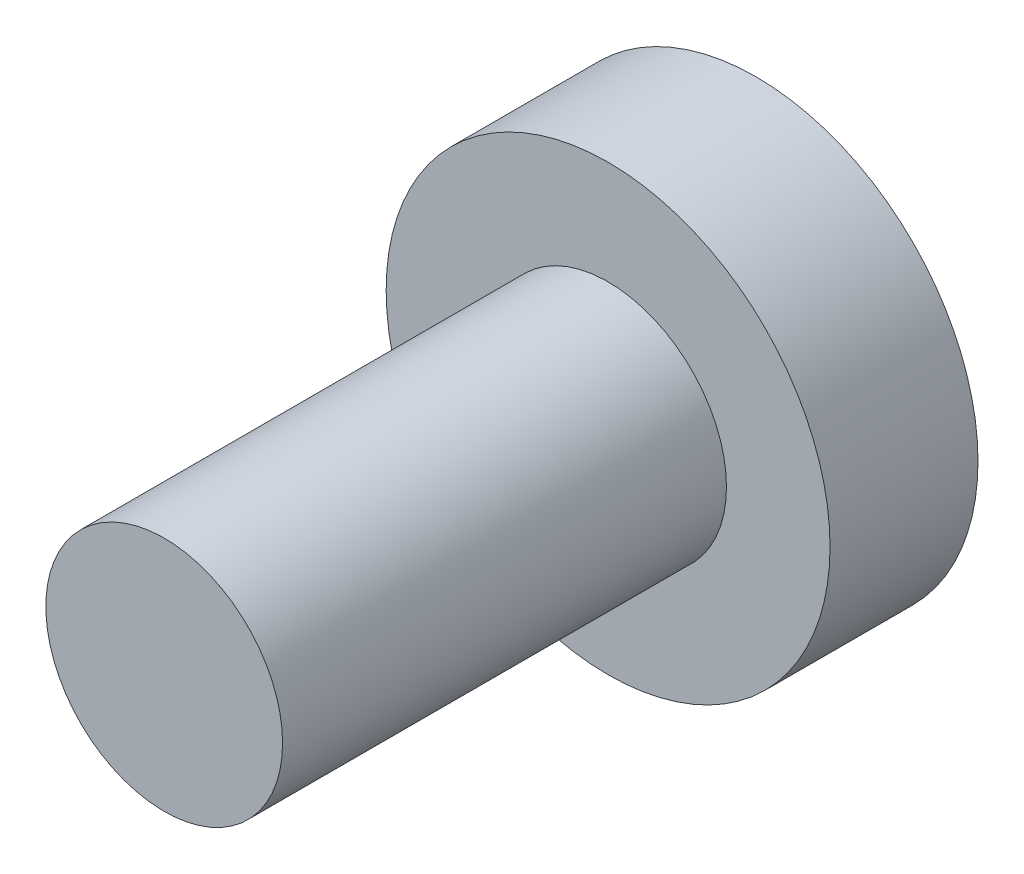
ISO-10303-21;
HEADER;
FILE_DESCRIPTION(('STEP AP214'),'2;1');
FILE_NAME('part.step','',(''),(''),'','','');
FILE_SCHEMA(('AUTOMOTIVE_DESIGN { 1 0 10303 214 1 1 1 1 }'));
ENDSEC;
DATA;
#1=APPLICATION_CONTEXT('core data for automotive mechanical design processes');
#2=APPLICATION_PROTOCOL_DEFINITION('international standard','automotive_design',2000,#1);
#3=PRODUCT_CONTEXT('',#1,'mechanical');
#4=PRODUCT('Part','Part','',(#3));
#5=PRODUCT_RELATED_PRODUCT_CATEGORY('part','',(#4));
#6=PRODUCT_DEFINITION_FORMATION('','',#4);
#7=PRODUCT_DEFINITION_CONTEXT('part definition',#1,'design');
#8=PRODUCT_DEFINITION('design','',#6,#7);
#9=PRODUCT_DEFINITION_SHAPE('','',#8);
#10=(LENGTH_UNIT() NAMED_UNIT(*) SI_UNIT(.MILLI.,.METRE.));
#11=(NAMED_UNIT(*) PLANE_ANGLE_UNIT() SI_UNIT($,.RADIAN.));
#12=(NAMED_UNIT(*) SI_UNIT($,.STERADIAN.) SOLID_ANGLE_UNIT());
#13=UNCERTAINTY_MEASURE_WITH_UNIT(LENGTH_MEASURE(1.E-05),#10,'distance_accuracy_value','');
#14=(GEOMETRIC_REPRESENTATION_CONTEXT(3) GLOBAL_UNCERTAINTY_ASSIGNED_CONTEXT((#13)) GLOBAL_UNIT_ASSIGNED_CONTEXT((#10,
#11,#12)) REPRESENTATION_CONTEXT('',''));
#15=CARTESIAN_POINT('',(0.,0.,0.));
#16=DIRECTION('',(0.,0.,1.));
#17=DIRECTION('',(1.,0.,0.));
#18=AXIS2_PLACEMENT_3D('',#15,#16,#17);
#19=CARTESIAN_POINT('',(0.,0.,0.));
#20=DIRECTION('',(0.,0.,1.));
#21=DIRECTION('',(1.,0.,0.));
#22=AXIS2_PLACEMENT_3D('',#19,#20,#21);
#23=PLANE('',#22);
#24=CARTESIAN_POINT('',(0.,0.,0.));
#25=DIRECTION('',(0.,0.,1.));
#26=DIRECTION('',(1.,0.,0.));
#27=AXIS2_PLACEMENT_3D('',#24,#25,#26);
#28=CIRCLE('',#27,3.75);
#29=CARTESIAN_POINT('',(3.75,0.,0.));
#30=VERTEX_POINT('',#29);
#31=EDGE_CURVE('E50',#30,#30,#28,.T.);
#32=ORIENTED_EDGE('',*,*,#31,.F.);
#33=EDGE_LOOP('',(#32));
#34=FACE_BOUND('',#33,.T.);
#35=DIRECTION('',(0.866025403784441,-0.499999999999995,0.));
#36=VECTOR('',#35,1.);
#37=CARTESIAN_POINT('',(-1.24999999999999,-0.721687836487047,0.));
#38=LINE('',#37,#36);
#39=CARTESIAN_POINT('',(-1.24999999999999,-0.721687836487047,0.));
#40=VERTEX_POINT('',#39);
#41=CARTESIAN_POINT('',(0.,-1.44337567297406,0.));
#42=VERTEX_POINT('',#41);
#43=EDGE_CURVE('E56',#40,#42,#38,.T.);
#44=ORIENTED_EDGE('',*,*,#43,.T.);
#45=DIRECTION('',(0.866025403784438,0.500000000000001,0.));
#46=VECTOR('',#45,1.);
#47=CARTESIAN_POINT('',(0.,-1.44337567297406,0.));
#48=LINE('',#47,#46);
#49=CARTESIAN_POINT('',(1.25,-0.721687836487029,0.));
#50=VERTEX_POINT('',#49);
#51=EDGE_CURVE('E137',#42,#50,#48,.T.);
#52=ORIENTED_EDGE('',*,*,#51,.T.);
#53=DIRECTION('',(0.,1.,0.));
#54=VECTOR('',#53,1.);
#55=CARTESIAN_POINT('',(1.25,-0.721687836487029,0.));
#56=LINE('',#55,#54);
#57=CARTESIAN_POINT('',(1.25,0.721687836487038,0.));
#58=VERTEX_POINT('',#57);
#59=EDGE_CURVE('E136',#50,#58,#56,.T.);
#60=ORIENTED_EDGE('',*,*,#59,.T.);
#61=DIRECTION('',(-0.866025403784442,0.499999999999995,0.));
#62=VECTOR('',#61,1.);
#63=CARTESIAN_POINT('',(1.25,0.721687836487038,0.));
#64=LINE('',#63,#62);
#65=CARTESIAN_POINT('',(0.,1.44337567297406,0.));
#66=VERTEX_POINT('',#65);
#67=EDGE_CURVE('E145',#58,#66,#64,.T.);
#68=ORIENTED_EDGE('',*,*,#67,.T.);
#69=DIRECTION('',(-0.866025403784434,-0.500000000000007,0.));
#70=VECTOR('',#69,1.);
#71=CARTESIAN_POINT('',(0.,1.44337567297406,0.));
#72=LINE('',#71,#70);
#73=CARTESIAN_POINT('',(-1.25000000000001,0.721687836487021,0.));
#74=VERTEX_POINT('',#73);
#75=EDGE_CURVE('E122',#66,#74,#72,.T.);
#76=ORIENTED_EDGE('',*,*,#75,.T.);
#77=DIRECTION('',(0.,-1.,0.));
#78=VECTOR('',#77,1.);
#79=CARTESIAN_POINT('',(-1.25000000000001,0.721687836487021,0.));
#80=LINE('',#79,#78);
#81=EDGE_CURVE('E149',#74,#40,#80,.T.);
#82=ORIENTED_EDGE('',*,*,#81,.T.);
#83=EDGE_LOOP('',(#44,#52,#60,#68,#76,#82));
#84=FACE_BOUND('',#83,.T.);
#85=ADVANCED_FACE('F43',(#34,#84),#23,.F.);
#86=CARTESIAN_POINT('',(0.,0.,2.5));
#87=DIRECTION('',(0.,0.,-1.));
#88=DIRECTION('',(-1.,0.,0.));
#89=AXIS2_PLACEMENT_3D('',#86,#87,#88);
#90=CYLINDRICAL_SURFACE('',#89,3.75);
#91=CARTESIAN_POINT('',(0.,0.,2.5));
#92=DIRECTION('',(0.,0.,1.));
#93=DIRECTION('',(1.,0.,0.));
#94=AXIS2_PLACEMENT_3D('',#91,#92,#93);
#95=CIRCLE('',#94,3.75);
#96=CARTESIAN_POINT('',(3.75,0.,2.5));
#97=VERTEX_POINT('',#96);
#98=EDGE_CURVE('E11',#97,#97,#95,.T.);
#99=ORIENTED_EDGE('',*,*,#98,.F.);
#100=EDGE_LOOP('',(#99));
#101=FACE_BOUND('',#100,.T.);
#102=ORIENTED_EDGE('',*,*,#31,.T.);
#103=EDGE_LOOP('',(#102));
#104=FACE_BOUND('',#103,.T.);
#105=ADVANCED_FACE('F44',(#101,#104),#90,.T.);
#106=CARTESIAN_POINT('',(0.,0.,2.5));
#107=DIRECTION('',(0.,0.,1.));
#108=DIRECTION('',(1.,0.,0.));
#109=AXIS2_PLACEMENT_3D('',#106,#107,#108);
#110=PLANE('',#109);
#111=CARTESIAN_POINT('',(0.,0.,2.5));
#112=DIRECTION('',(0.,0.,1.));
#113=DIRECTION('',(1.,0.,0.));
#114=AXIS2_PLACEMENT_3D('',#111,#112,#113);
#115=CIRCLE('',#114,2.);
#116=CARTESIAN_POINT('',(2.,0.,2.5));
#117=VERTEX_POINT('',#116);
#118=EDGE_CURVE('E166',#117,#117,#115,.F.);
#119=ORIENTED_EDGE('',*,*,#118,.T.);
#120=EDGE_LOOP('',(#119));
#121=FACE_BOUND('',#120,.T.);
#122=ORIENTED_EDGE('',*,*,#98,.T.);
#123=EDGE_LOOP('',(#122));
#124=FACE_BOUND('',#123,.T.);
#125=ADVANCED_FACE('F211',(#121,#124),#110,.T.);
#126=CARTESIAN_POINT('',(0.,0.,10.));
#127=DIRECTION('',(0.,0.,-1.));
#128=DIRECTION('',(-1.,0.,0.));
#129=AXIS2_PLACEMENT_3D('',#126,#127,#128);
#130=CYLINDRICAL_SURFACE('',#129,2.);
#131=ORIENTED_EDGE('',*,*,#118,.F.);
#132=EDGE_LOOP('',(#131));
#133=FACE_BOUND('',#132,.T.);
#134=CARTESIAN_POINT('',(0.,0.,10.));
#135=DIRECTION('',(0.,0.,1.));
#136=DIRECTION('',(1.,0.,0.));
#137=AXIS2_PLACEMENT_3D('',#134,#135,#136);
#138=CIRCLE('',#137,2.);
#139=CARTESIAN_POINT('',(2.,0.,10.));
#140=VERTEX_POINT('',#139);
#141=EDGE_CURVE('E164',#140,#140,#138,.T.);
#142=ORIENTED_EDGE('',*,*,#141,.F.);
#143=EDGE_LOOP('',(#142));
#144=FACE_BOUND('',#143,.T.);
#145=ADVANCED_FACE('F210',(#133,#144),#130,.T.);
#146=CARTESIAN_POINT('',(0.,0.,10.));
#147=DIRECTION('',(0.,0.,1.));
#148=DIRECTION('',(1.,0.,0.));
#149=AXIS2_PLACEMENT_3D('',#146,#147,#148);
#150=PLANE('',#149);
#151=ORIENTED_EDGE('',*,*,#141,.T.);
#152=EDGE_LOOP('',(#151));
#153=FACE_BOUND('',#152,.T.);
#154=ADVANCED_FACE('F203',(#153),#150,.T.);
#155=CARTESIAN_POINT('',(-1.24999999999999,-0.721687836487047,1.5));
#156=DIRECTION('',(0.499999999999995,0.866025403784441,0.));
#157=DIRECTION('',(-0.866025403784442,0.499999999999995,0.));
#158=AXIS2_PLACEMENT_3D('',#155,#156,#157);
#159=PLANE('',#158);
#160=ORIENTED_EDGE('',*,*,#43,.F.);
#161=DIRECTION('',(0.,0.,-1.));
#162=VECTOR('',#161,1.);
#163=CARTESIAN_POINT('',(-1.24999999999999,-0.721687836487047,1.5));
#164=LINE('',#163,#162);
#165=CARTESIAN_POINT('',(-1.24999999999999,-0.721687836487047,1.5));
#166=VERTEX_POINT('',#165);
#167=EDGE_CURVE('E128',#166,#40,#164,.T.);
#168=ORIENTED_EDGE('',*,*,#167,.F.);
#169=DIRECTION('',(0.866025403784441,-0.499999999999995,0.));
#170=VECTOR('',#169,1.);
#171=CARTESIAN_POINT('',(-1.24999999999999,-0.721687836487047,1.5));
#172=LINE('',#171,#170);
#173=CARTESIAN_POINT('',(0.,-1.44337567297406,1.5));
#174=VERTEX_POINT('',#173);
#175=EDGE_CURVE('E153',#166,#174,#172,.T.);
#176=ORIENTED_EDGE('',*,*,#175,.T.);
#177=DIRECTION('',(0.,0.,-1.));
#178=VECTOR('',#177,1.);
#179=CARTESIAN_POINT('',(0.,-1.44337567297406,1.5));
#180=LINE('',#179,#178);
#181=EDGE_CURVE('E165',#174,#42,#180,.T.);
#182=ORIENTED_EDGE('',*,*,#181,.T.);
#183=EDGE_LOOP('',(#160,#168,#176,#182));
#184=FACE_BOUND('',#183,.T.);
#185=ADVANCED_FACE('F181',(#184),#159,.T.);
#186=CARTESIAN_POINT('',(0.,-1.44337567297406,1.5));
#187=DIRECTION('',(-0.500000000000001,0.866025403784438,0.));
#188=DIRECTION('',(-0.866025403784438,-0.500000000000001,0.));
#189=AXIS2_PLACEMENT_3D('',#186,#187,#188);
#190=PLANE('',#189);
#191=ORIENTED_EDGE('',*,*,#51,.F.);
#192=ORIENTED_EDGE('',*,*,#181,.F.);
#193=DIRECTION('',(0.866025403784438,0.500000000000001,0.));
#194=VECTOR('',#193,1.);
#195=CARTESIAN_POINT('',(0.,-1.44337567297406,1.5));
#196=LINE('',#195,#194);
#197=CARTESIAN_POINT('',(1.25,-0.721687836487029,1.5));
#198=VERTEX_POINT('',#197);
#199=EDGE_CURVE('E98',#174,#198,#196,.T.);
#200=ORIENTED_EDGE('',*,*,#199,.T.);
#201=DIRECTION('',(0.,0.,-1.));
#202=VECTOR('',#201,1.);
#203=CARTESIAN_POINT('',(1.25,-0.721687836487029,1.5));
#204=LINE('',#203,#202);
#205=EDGE_CURVE('E157',#198,#50,#204,.T.);
#206=ORIENTED_EDGE('',*,*,#205,.T.);
#207=EDGE_LOOP('',(#191,#192,#200,#206));
#208=FACE_BOUND('',#207,.T.);
#209=ADVANCED_FACE('F194',(#208),#190,.T.);
#210=CARTESIAN_POINT('',(1.25,-0.721687836487029,1.5));
#211=DIRECTION('',(-1.,0.,0.));
#212=DIRECTION('',(0.,-1.,0.));
#213=AXIS2_PLACEMENT_3D('',#210,#211,#212);
#214=PLANE('',#213);
#215=ORIENTED_EDGE('',*,*,#59,.F.);
#216=ORIENTED_EDGE('',*,*,#205,.F.);
#217=DIRECTION('',(0.,1.,0.));
#218=VECTOR('',#217,1.);
#219=CARTESIAN_POINT('',(1.25,-0.721687836487029,1.5));
#220=LINE('',#219,#218);
#221=CARTESIAN_POINT('',(1.25,0.721687836487038,1.5));
#222=VERTEX_POINT('',#221);
#223=EDGE_CURVE('E120',#198,#222,#220,.T.);
#224=ORIENTED_EDGE('',*,*,#223,.T.);
#225=DIRECTION('',(0.,0.,-1.));
#226=VECTOR('',#225,1.);
#227=CARTESIAN_POINT('',(1.25,0.721687836487038,1.5));
#228=LINE('',#227,#226);
#229=EDGE_CURVE('E114',#222,#58,#228,.T.);
#230=ORIENTED_EDGE('',*,*,#229,.T.);
#231=EDGE_LOOP('',(#215,#216,#224,#230));
#232=FACE_BOUND('',#231,.T.);
#233=ADVANCED_FACE('F195',(#232),#214,.T.);
#234=CARTESIAN_POINT('',(1.25,0.721687836487038,1.5));
#235=DIRECTION('',(-0.499999999999995,-0.866025403784441,0.));
#236=DIRECTION('',(0.866025403784442,-0.499999999999995,0.));
#237=AXIS2_PLACEMENT_3D('',#234,#235,#236);
#238=PLANE('',#237);
#239=ORIENTED_EDGE('',*,*,#67,.F.);
#240=ORIENTED_EDGE('',*,*,#229,.F.);
#241=DIRECTION('',(-0.866025403784442,0.499999999999995,0.));
#242=VECTOR('',#241,1.);
#243=CARTESIAN_POINT('',(1.25,0.721687836487038,1.5));
#244=LINE('',#243,#242);
#245=CARTESIAN_POINT('',(0.,1.44337567297406,1.5));
#246=VERTEX_POINT('',#245);
#247=EDGE_CURVE('E107',#222,#246,#244,.T.);
#248=ORIENTED_EDGE('',*,*,#247,.T.);
#249=DIRECTION('',(0.,0.,-1.));
#250=VECTOR('',#249,1.);
#251=CARTESIAN_POINT('',(0.,1.44337567297406,1.5));
#252=LINE('',#251,#250);
#253=EDGE_CURVE('E115',#246,#66,#252,.T.);
#254=ORIENTED_EDGE('',*,*,#253,.T.);
#255=EDGE_LOOP('',(#239,#240,#248,#254));
#256=FACE_BOUND('',#255,.T.);
#257=ADVANCED_FACE('F112',(#256),#238,.T.);
#258=CARTESIAN_POINT('',(0.,1.44337567297406,1.5));
#259=DIRECTION('',(0.500000000000007,-0.866025403784435,0.));
#260=DIRECTION('',(0.866025403784434,0.500000000000007,0.));
#261=AXIS2_PLACEMENT_3D('',#258,#259,#260);
#262=PLANE('',#261);
#263=ORIENTED_EDGE('',*,*,#75,.F.);
#264=ORIENTED_EDGE('',*,*,#253,.F.);
#265=DIRECTION('',(-0.866025403784434,-0.500000000000007,0.));
#266=VECTOR('',#265,1.);
#267=CARTESIAN_POINT('',(0.,1.44337567297406,1.5));
#268=LINE('',#267,#266);
#269=CARTESIAN_POINT('',(-1.25000000000001,0.721687836487021,1.5));
#270=VERTEX_POINT('',#269);
#271=EDGE_CURVE('E117',#246,#270,#268,.T.);
#272=ORIENTED_EDGE('',*,*,#271,.T.);
#273=DIRECTION('',(0.,0.,-1.));
#274=VECTOR('',#273,1.);
#275=CARTESIAN_POINT('',(-1.25000000000001,0.721687836487021,1.5));
#276=LINE('',#275,#274);
#277=EDGE_CURVE('E90',#270,#74,#276,.T.);
#278=ORIENTED_EDGE('',*,*,#277,.T.);
#279=EDGE_LOOP('',(#263,#264,#272,#278));
#280=FACE_BOUND('',#279,.T.);
#281=ADVANCED_FACE('F116',(#280),#262,.T.);
#282=CARTESIAN_POINT('',(-1.25000000000001,0.721687836487021,1.5));
#283=DIRECTION('',(1.,0.,0.));
#284=DIRECTION('',(0.,1.,0.));
#285=AXIS2_PLACEMENT_3D('',#282,#283,#284);
#286=PLANE('',#285);
#287=ORIENTED_EDGE('',*,*,#81,.F.);
#288=ORIENTED_EDGE('',*,*,#277,.F.);
#289=DIRECTION('',(0.,-1.,0.));
#290=VECTOR('',#289,1.);
#291=CARTESIAN_POINT('',(-1.25000000000001,0.721687836487021,1.5));
#292=LINE('',#291,#290);
#293=EDGE_CURVE('E70',#270,#166,#292,.T.);
#294=ORIENTED_EDGE('',*,*,#293,.T.);
#295=ORIENTED_EDGE('',*,*,#167,.T.);
#296=EDGE_LOOP('',(#287,#288,#294,#295));
#297=FACE_BOUND('',#296,.T.);
#298=ADVANCED_FACE('F185',(#297),#286,.T.);
#299=CARTESIAN_POINT('',(0.,0.,1.5));
#300=DIRECTION('',(0.,0.,1.));
#301=DIRECTION('',(1.,0.,0.));
#302=AXIS2_PLACEMENT_3D('',#299,#300,#301);
#303=PLANE('',#302);
#304=ORIENTED_EDGE('',*,*,#175,.F.);
#305=ORIENTED_EDGE('',*,*,#293,.F.);
#306=ORIENTED_EDGE('',*,*,#271,.F.);
#307=ORIENTED_EDGE('',*,*,#247,.F.);
#308=ORIENTED_EDGE('',*,*,#223,.F.);
#309=ORIENTED_EDGE('',*,*,#199,.F.);
#310=EDGE_LOOP('',(#304,#305,#306,#307,#308,#309));
#311=FACE_BOUND('',#310,.T.);
#312=ADVANCED_FACE('F121',(#311),#303,.F.);
#313=CLOSED_SHELL('',(#85,#105,#125,#145,#154,#185,#209,#233,#257,#281,#298,#312));
#314=MANIFOLD_SOLID_BREP('B2',#313);
#315=ADVANCED_BREP_SHAPE_REPRESENTATION('',(#18,#314),#14);
#316=SHAPE_DEFINITION_REPRESENTATION(#9,#315);
ENDSEC;
END-ISO-10303-21;
